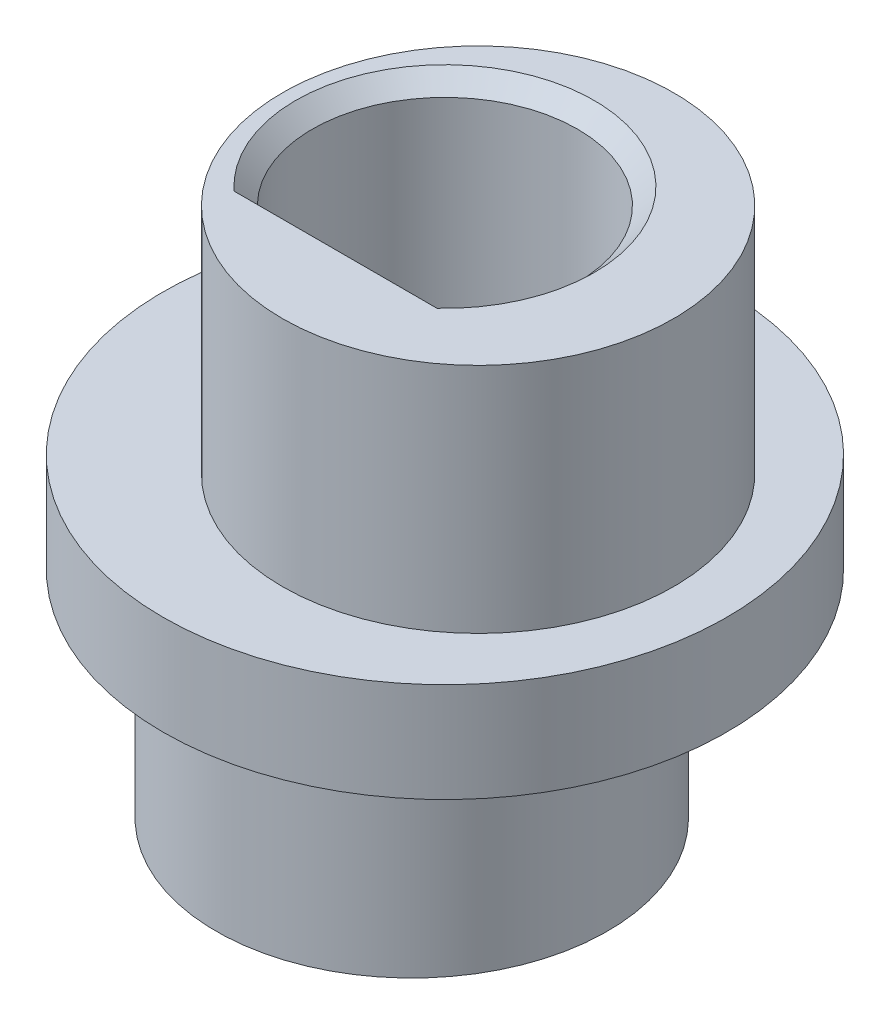
ISO-10303-21;
HEADER;
FILE_DESCRIPTION(('STEP AP214'),'2;1');
FILE_NAME('part.step','',(''),(''),'','','');
FILE_SCHEMA(('AUTOMOTIVE_DESIGN { 1 0 10303 214 1 1 1 1 }'));
ENDSEC;
DATA;
#1=APPLICATION_CONTEXT('core data for automotive mechanical design processes');
#2=APPLICATION_PROTOCOL_DEFINITION('international standard','automotive_design',2000,#1);
#3=PRODUCT_CONTEXT('',#1,'mechanical');
#4=PRODUCT('Part','Part','',(#3));
#5=PRODUCT_RELATED_PRODUCT_CATEGORY('part','',(#4));
#6=PRODUCT_DEFINITION_FORMATION('','',#4);
#7=PRODUCT_DEFINITION_CONTEXT('part definition',#1,'design');
#8=PRODUCT_DEFINITION('design','',#6,#7);
#9=PRODUCT_DEFINITION_SHAPE('','',#8);
#10=(LENGTH_UNIT() NAMED_UNIT(*) SI_UNIT(.MILLI.,.METRE.));
#11=(NAMED_UNIT(*) PLANE_ANGLE_UNIT() SI_UNIT($,.RADIAN.));
#12=(NAMED_UNIT(*) SI_UNIT($,.STERADIAN.) SOLID_ANGLE_UNIT());
#13=UNCERTAINTY_MEASURE_WITH_UNIT(LENGTH_MEASURE(1.E-05),#10,'distance_accuracy_value','');
#14=(GEOMETRIC_REPRESENTATION_CONTEXT(3) GLOBAL_UNCERTAINTY_ASSIGNED_CONTEXT((#13)) GLOBAL_UNIT_ASSIGNED_CONTEXT((#10,
#11,#12)) REPRESENTATION_CONTEXT('',''));
#15=CARTESIAN_POINT('',(0.,0.,0.));
#16=DIRECTION('',(0.,0.,1.));
#17=DIRECTION('',(1.,0.,0.));
#18=AXIS2_PLACEMENT_3D('',#15,#16,#17);
#19=CARTESIAN_POINT('',(0.,1.5,0.));
#20=DIRECTION('',(0.,-1.,0.));
#21=DIRECTION('',(0.,0.,-1.));
#22=AXIS2_PLACEMENT_3D('',#19,#20,#21);
#23=CYLINDRICAL_SURFACE('',#22,8.5);
#24=CARTESIAN_POINT('',(0.,1.5,0.));
#25=DIRECTION('',(0.,1.,0.));
#26=DIRECTION('',(0.,0.,1.));
#27=AXIS2_PLACEMENT_3D('',#24,#25,#26);
#28=CIRCLE('',#27,8.5);
#29=CARTESIAN_POINT('',(0.,1.5,8.5));
#30=VERTEX_POINT('',#29);
#31=EDGE_CURVE('E182',#30,#30,#28,.T.);
#32=ORIENTED_EDGE('',*,*,#31,.F.);
#33=EDGE_LOOP('',(#32));
#34=FACE_BOUND('',#33,.T.);
#35=CARTESIAN_POINT('',(0.,-1.5,0.));
#36=DIRECTION('',(0.,1.,0.));
#37=DIRECTION('',(0.,0.,1.));
#38=AXIS2_PLACEMENT_3D('',#35,#36,#37);
#39=CIRCLE('',#38,8.5);
#40=CARTESIAN_POINT('',(0.,-1.5,8.5));
#41=VERTEX_POINT('',#40);
#42=EDGE_CURVE('E178',#41,#41,#39,.T.);
#43=ORIENTED_EDGE('',*,*,#42,.T.);
#44=EDGE_LOOP('',(#43));
#45=FACE_BOUND('',#44,.T.);
#46=ADVANCED_FACE('F43',(#34,#45),#23,.T.);
#47=CARTESIAN_POINT('',(0.,1.5,0.));
#48=DIRECTION('',(0.,1.,0.));
#49=DIRECTION('',(0.,0.,1.));
#50=AXIS2_PLACEMENT_3D('',#47,#48,#49);
#51=PLANE('',#50);
#52=CARTESIAN_POINT('',(1.,1.5,0.));
#53=DIRECTION('',(0.,1.,0.));
#54=DIRECTION('',(0.,0.,1.));
#55=AXIS2_PLACEMENT_3D('',#52,#53,#54);
#56=CIRCLE('',#55,5.9);
#57=CARTESIAN_POINT('',(1.,1.5,5.9));
#58=VERTEX_POINT('',#57);
#59=EDGE_CURVE('E173',#58,#58,#56,.T.);
#60=ORIENTED_EDGE('',*,*,#59,.F.);
#61=EDGE_LOOP('',(#60));
#62=FACE_BOUND('',#61,.T.);
#63=ORIENTED_EDGE('',*,*,#31,.T.);
#64=EDGE_LOOP('',(#63));
#65=FACE_BOUND('',#64,.T.);
#66=ADVANCED_FACE('F188',(#62,#65),#51,.T.);
#67=CARTESIAN_POINT('',(0.,-1.5,0.));
#68=DIRECTION('',(0.,1.,0.));
#69=DIRECTION('',(0.,0.,1.));
#70=AXIS2_PLACEMENT_3D('',#67,#68,#69);
#71=PLANE('',#70);
#72=CARTESIAN_POINT('',(-1.,-1.5,0.));
#73=DIRECTION('',(0.,-1.,0.));
#74=DIRECTION('',(0.,0.,-1.));
#75=AXIS2_PLACEMENT_3D('',#72,#73,#74);
#76=CIRCLE('',#75,5.9);
#77=CARTESIAN_POINT('',(-1.,-1.5,-5.9));
#78=VERTEX_POINT('',#77);
#79=EDGE_CURVE('E106',#78,#78,#76,.T.);
#80=ORIENTED_EDGE('',*,*,#79,.F.);
#81=EDGE_LOOP('',(#80));
#82=FACE_BOUND('',#81,.T.);
#83=ORIENTED_EDGE('',*,*,#42,.F.);
#84=EDGE_LOOP('',(#83));
#85=FACE_BOUND('',#84,.T.);
#86=ADVANCED_FACE('F189',(#82,#85),#71,.F.);
#87=CARTESIAN_POINT('',(1.,8.5,0.));
#88=DIRECTION('',(0.,-1.,0.));
#89=DIRECTION('',(0.,0.,-1.));
#90=AXIS2_PLACEMENT_3D('',#87,#88,#89);
#91=CYLINDRICAL_SURFACE('',#90,5.9);
#92=CARTESIAN_POINT('',(1.,8.5,0.));
#93=DIRECTION('',(0.,1.,0.));
#94=DIRECTION('',(0.,0.,1.));
#95=AXIS2_PLACEMENT_3D('',#92,#93,#94);
#96=CIRCLE('',#95,5.9);
#97=CARTESIAN_POINT('',(1.,8.5,5.9));
#98=VERTEX_POINT('',#97);
#99=EDGE_CURVE('E166',#98,#98,#96,.T.);
#100=ORIENTED_EDGE('',*,*,#99,.F.);
#101=EDGE_LOOP('',(#100));
#102=FACE_BOUND('',#101,.T.);
#103=ORIENTED_EDGE('',*,*,#59,.T.);
#104=EDGE_LOOP('',(#103));
#105=FACE_BOUND('',#104,.T.);
#106=ADVANCED_FACE('F186',(#102,#105),#91,.T.);
#107=CARTESIAN_POINT('',(1.,8.5,0.));
#108=DIRECTION('',(0.,1.,0.));
#109=DIRECTION('',(0.,0.,1.));
#110=AXIS2_PLACEMENT_3D('',#107,#108,#109);
#111=PLANE('',#110);
#112=CARTESIAN_POINT('',(0.,8.5,0.));
#113=DIRECTION('',(0.,1.,0.));
#114=DIRECTION('',(0.,0.,1.));
#115=AXIS2_PLACEMENT_3D('',#112,#113,#114);
#116=CIRCLE('',#115,4.5);
#117=CARTESIAN_POINT('',(-3.05941170815665,8.5,3.2999999999991));
#118=VERTEX_POINT('',#117);
#119=CARTESIAN_POINT('',(3.05941170815665,8.5,3.2999999999991));
#120=VERTEX_POINT('',#119);
#121=EDGE_CURVE('E59',#118,#120,#116,.F.);
#122=ORIENTED_EDGE('',*,*,#121,.T.);
#123=DIRECTION('',(-1.,0.,0.));
#124=VECTOR('',#123,1.);
#125=CARTESIAN_POINT('',(-2.85657137141714,8.5,3.3));
#126=LINE('',#125,#124);
#127=EDGE_CURVE('E11',#120,#118,#126,.T.);
#128=ORIENTED_EDGE('',*,*,#127,.T.);
#129=EDGE_LOOP('',(#122,#128));
#130=FACE_BOUND('',#129,.T.);
#131=ORIENTED_EDGE('',*,*,#99,.T.);
#132=EDGE_LOOP('',(#131));
#133=FACE_BOUND('',#132,.T.);
#134=ADVANCED_FACE('F197',(#130,#133),#111,.T.);
#135=CARTESIAN_POINT('',(-1.,-8.5,0.));
#136=DIRECTION('',(0.,1.,0.));
#137=DIRECTION('',(0.,0.,1.));
#138=AXIS2_PLACEMENT_3D('',#135,#136,#137);
#139=CYLINDRICAL_SURFACE('',#138,5.9);
#140=CARTESIAN_POINT('',(-1.,-8.5,0.));
#141=DIRECTION('',(0.,-1.,0.));
#142=DIRECTION('',(0.,0.,-1.));
#143=AXIS2_PLACEMENT_3D('',#140,#141,#142);
#144=CIRCLE('',#143,5.9);
#145=CARTESIAN_POINT('',(-1.,-8.5,-5.9));
#146=VERTEX_POINT('',#145);
#147=EDGE_CURVE('E167',#146,#146,#144,.T.);
#148=ORIENTED_EDGE('',*,*,#147,.F.);
#149=EDGE_LOOP('',(#148));
#150=FACE_BOUND('',#149,.T.);
#151=ORIENTED_EDGE('',*,*,#79,.T.);
#152=EDGE_LOOP('',(#151));
#153=FACE_BOUND('',#152,.T.);
#154=ADVANCED_FACE('F233',(#150,#153),#139,.T.);
#155=CARTESIAN_POINT('',(-1.,-8.5,0.));
#156=DIRECTION('',(0.,-1.,0.));
#157=DIRECTION('',(0.,0.,-1.));
#158=AXIS2_PLACEMENT_3D('',#155,#156,#157);
#159=PLANE('',#158);
#160=CARTESIAN_POINT('',(0.,-8.5,0.));
#161=DIRECTION('',(0.,-1.,0.));
#162=DIRECTION('',(0.,0.,-1.));
#163=AXIS2_PLACEMENT_3D('',#160,#161,#162);
#164=CIRCLE('',#163,4.50000000000001);
#165=CARTESIAN_POINT('',(3.05941170815665,-8.5,3.2999999999991));
#166=VERTEX_POINT('',#165);
#167=CARTESIAN_POINT('',(-3.05941170815665,-8.5,3.2999999999991));
#168=VERTEX_POINT('',#167);
#169=EDGE_CURVE('E103',#166,#168,#164,.F.);
#170=ORIENTED_EDGE('',*,*,#169,.T.);
#171=DIRECTION('',(1.,0.,0.));
#172=VECTOR('',#171,1.);
#173=CARTESIAN_POINT('',(2.85657137141714,-8.5,3.30000000000001));
#174=LINE('',#173,#172);
#175=EDGE_CURVE('E92',#168,#166,#174,.T.);
#176=ORIENTED_EDGE('',*,*,#175,.T.);
#177=EDGE_LOOP('',(#170,#176));
#178=FACE_BOUND('',#177,.T.);
#179=ORIENTED_EDGE('',*,*,#147,.T.);
#180=EDGE_LOOP('',(#179));
#181=FACE_BOUND('',#180,.T.);
#182=ADVANCED_FACE('F107',(#178,#181),#159,.T.);
#183=CARTESIAN_POINT('',(0.,-8.5,0.));
#184=DIRECTION('',(0.,1.,0.));
#185=DIRECTION('',(0.,0.,1.));
#186=AXIS2_PLACEMENT_3D('',#183,#184,#185);
#187=CYLINDRICAL_SURFACE('',#186,4.);
#188=DIRECTION('',(0.,1.,0.));
#189=VECTOR('',#188,1.);
#190=CARTESIAN_POINT('',(-2.85657137141714,-8.5,2.8));
#191=LINE('',#190,#189);
#192=CARTESIAN_POINT('',(-2.85657137141714,-7.99999999999999,2.8));
#193=VERTEX_POINT('',#192);
#194=CARTESIAN_POINT('',(-2.85657137141714,8.,2.8));
#195=VERTEX_POINT('',#194);
#196=EDGE_CURVE('E163',#193,#195,#191,.T.);
#197=ORIENTED_EDGE('',*,*,#196,.F.);
#198=CARTESIAN_POINT('',(0.,-7.99999999999999,0.));
#199=DIRECTION('',(0.,-1.,0.));
#200=DIRECTION('',(0.,0.,-1.));
#201=AXIS2_PLACEMENT_3D('',#198,#199,#200);
#202=CIRCLE('',#201,4.);
#203=CARTESIAN_POINT('',(2.85657137141714,-7.99999999999999,2.8));
#204=VERTEX_POINT('',#203);
#205=EDGE_CURVE('E116',#193,#204,#202,.T.);
#206=ORIENTED_EDGE('',*,*,#205,.T.);
#207=DIRECTION('',(0.,1.,0.));
#208=VECTOR('',#207,1.);
#209=CARTESIAN_POINT('',(2.85657137141714,-8.5,2.8));
#210=LINE('',#209,#208);
#211=CARTESIAN_POINT('',(2.85657137141714,8.,2.8));
#212=VERTEX_POINT('',#211);
#213=EDGE_CURVE('E162',#204,#212,#210,.T.);
#214=ORIENTED_EDGE('',*,*,#213,.T.);
#215=CARTESIAN_POINT('',(0.,8.,0.));
#216=DIRECTION('',(0.,1.,0.));
#217=DIRECTION('',(0.,0.,1.));
#218=AXIS2_PLACEMENT_3D('',#215,#216,#217);
#219=CIRCLE('',#218,4.);
#220=EDGE_CURVE('E119',#212,#195,#219,.T.);
#221=ORIENTED_EDGE('',*,*,#220,.T.);
#222=EDGE_LOOP('',(#197,#206,#214,#221));
#223=FACE_BOUND('',#222,.T.);
#224=ADVANCED_FACE('F164',(#223),#187,.F.);
#225=CARTESIAN_POINT('',(-2.85657137141714,-8.5,2.8));
#226=DIRECTION('',(0.,0.,1.));
#227=DIRECTION('',(1.,0.,0.));
#228=AXIS2_PLACEMENT_3D('',#225,#226,#227);
#229=PLANE('',#228);
#230=ORIENTED_EDGE('',*,*,#213,.F.);
#231=DIRECTION('',(-1.,0.,0.));
#232=VECTOR('',#231,1.);
#233=CARTESIAN_POINT('',(-2.85657137141714,-7.99999999999999,2.8));
#234=LINE('',#233,#232);
#235=EDGE_CURVE('E100',#204,#193,#234,.T.);
#236=ORIENTED_EDGE('',*,*,#235,.T.);
#237=ORIENTED_EDGE('',*,*,#196,.T.);
#238=DIRECTION('',(1.,0.,0.));
#239=VECTOR('',#238,1.);
#240=CARTESIAN_POINT('',(2.85657137141714,8.,2.8));
#241=LINE('',#240,#239);
#242=EDGE_CURVE('E109',#195,#212,#241,.T.);
#243=ORIENTED_EDGE('',*,*,#242,.T.);
#244=EDGE_LOOP('',(#230,#236,#237,#243));
#245=FACE_BOUND('',#244,.T.);
#246=ADVANCED_FACE('F139',(#245),#229,.F.);
#247=CARTESIAN_POINT('',(0.,-8.5,0.));
#248=DIRECTION('',(0.,-1.,0.));
#249=DIRECTION('',(0.,0.,-1.));
#250=AXIS2_PLACEMENT_3D('',#247,#248,#249);
#251=CONICAL_SURFACE('',#250,4.50000000000001,0.785398163397448);
#252=CARTESIAN_POINT('',(3.05941170815749,-8.5,3.30000000000001));
#253=CARTESIAN_POINT('',(3.02667575156098,-8.4164495816364,3.21644958163641));
#254=CARTESIAN_POINT('',(2.99340443304797,-8.33300775626197,3.13300775626198));
#255=CARTESIAN_POINT('',(2.92579099006949,-8.16634108906759,2.9663410890676));
#256=CARTESIAN_POINT('',(2.89144886300313,-8.08311624777521,2.88311624777522));
#257=CARTESIAN_POINT('',(2.85657137141939,-7.99999999999955,2.79999999999956));
#258=B_SPLINE_CURVE_WITH_KNOTS('',3,(#252,#253,#254,#255,#256,#257),.UNSPECIFIED.,.F.,.F.,(4,2,
4),(0.,0.367815869305649,0.73563263206875),.UNSPECIFIED.);
#259=EDGE_CURVE('E93',#204,#166,#258,.F.);
#260=ORIENTED_EDGE('',*,*,#259,.F.);
#261=ORIENTED_EDGE('',*,*,#205,.F.);
#262=CARTESIAN_POINT('',(-2.85657137141714,-7.99999999999999,2.8));
#263=CARTESIAN_POINT('',(-2.89144886300229,-8.08311624777537,2.88311624777538));
#264=CARTESIAN_POINT('',(-2.92579099006939,-8.1663410890676,2.96634108906761));
#265=CARTESIAN_POINT('',(-2.99340443304806,-8.33300775626195,3.13300775626196));
#266=CARTESIAN_POINT('',(-3.02667575156052,-8.41644958163651,3.21644958163651));
#267=CARTESIAN_POINT('',(-3.05941170815581,-8.50000000000035,3.30000000000036));
#268=B_SPLINE_CURVE_WITH_KNOTS('',3,(#262,#263,#264,#265,#266,#267),.UNSPECIFIED.,.F.,.F.,(4,2,
4),(0.,0.367816762763132,0.735632632068806),.UNSPECIFIED.);
#269=EDGE_CURVE('E99',#168,#193,#268,.F.);
#270=ORIENTED_EDGE('',*,*,#269,.F.);
#271=ORIENTED_EDGE('',*,*,#169,.F.);
#272=EDGE_LOOP('',(#260,#261,#270,#271));
#273=FACE_BOUND('',#272,.T.);
#274=ADVANCED_FACE('F102',(#273),#251,.F.);
#275=CARTESIAN_POINT('',(-1.,-8.5,3.30000000000001));
#276=DIRECTION('',(0.,-0.707106781186547,-0.707106781186547));
#277=DIRECTION('',(-1.,0.,0.));
#278=AXIS2_PLACEMENT_3D('',#275,#276,#277);
#279=PLANE('',#278);
#280=ORIENTED_EDGE('',*,*,#269,.T.);
#281=ORIENTED_EDGE('',*,*,#235,.F.);
#282=ORIENTED_EDGE('',*,*,#259,.T.);
#283=ORIENTED_EDGE('',*,*,#175,.F.);
#284=EDGE_LOOP('',(#280,#281,#282,#283));
#285=FACE_BOUND('',#284,.T.);
#286=ADVANCED_FACE('F91',(#285),#279,.T.);
#287=CARTESIAN_POINT('',(0.,8.,0.));
#288=DIRECTION('',(0.,1.,0.));
#289=DIRECTION('',(0.,0.,1.));
#290=AXIS2_PLACEMENT_3D('',#287,#288,#289);
#291=CONICAL_SURFACE('',#290,4.,0.785398163397448);
#292=CARTESIAN_POINT('',(2.85657137141714,8.,2.8));
#293=CARTESIAN_POINT('',(2.89144886300229,8.08311624777537,2.88311624777537));
#294=CARTESIAN_POINT('',(2.92579099006939,8.1663410890676,2.96634108906761));
#295=CARTESIAN_POINT('',(2.99340443304806,8.33300775626195,3.13300775626196));
#296=CARTESIAN_POINT('',(3.02667575156052,8.41644958163651,3.21644958163651));
#297=CARTESIAN_POINT('',(3.05941170815581,8.50000000000035,3.30000000000036));
#298=B_SPLINE_CURVE_WITH_KNOTS('',3,(#292,#293,#294,#295,#296,#297),.UNSPECIFIED.,.F.,.F.,(4,2,
4),(0.,0.367816762763128,0.735632632068801),.UNSPECIFIED.);
#299=EDGE_CURVE('E149',#120,#212,#298,.F.);
#300=ORIENTED_EDGE('',*,*,#299,.F.);
#301=ORIENTED_EDGE('',*,*,#121,.F.);
#302=CARTESIAN_POINT('',(-3.05941170815749,8.5,3.3));
#303=CARTESIAN_POINT('',(-3.02667575156098,8.4164495816364,3.21644958163641));
#304=CARTESIAN_POINT('',(-2.99340443304797,8.33300775626197,3.13300775626197));
#305=CARTESIAN_POINT('',(-2.92579099006949,8.16634108906759,2.96634108906759));
#306=CARTESIAN_POINT('',(-2.89144886300313,8.08311624777521,2.88311624777521));
#307=CARTESIAN_POINT('',(-2.85657137141938,7.99999999999956,2.79999999999956));
#308=B_SPLINE_CURVE_WITH_KNOTS('',3,(#302,#303,#304,#305,#306,#307),.UNSPECIFIED.,.F.,.F.,(4,2,
4),(0.,0.367815869305647,0.735632632068745),.UNSPECIFIED.);
#309=EDGE_CURVE('E47',#195,#118,#308,.F.);
#310=ORIENTED_EDGE('',*,*,#309,.F.);
#311=ORIENTED_EDGE('',*,*,#220,.F.);
#312=EDGE_LOOP('',(#300,#301,#310,#311));
#313=FACE_BOUND('',#312,.T.);
#314=ADVANCED_FACE('F46',(#313),#291,.F.);
#315=CARTESIAN_POINT('',(-2.85657137141714,8.,2.8));
#316=DIRECTION('',(0.,0.707106781186547,-0.707106781186547));
#317=DIRECTION('',(-1.,0.,0.));
#318=AXIS2_PLACEMENT_3D('',#315,#316,#317);
#319=PLANE('',#318);
#320=ORIENTED_EDGE('',*,*,#309,.T.);
#321=ORIENTED_EDGE('',*,*,#127,.F.);
#322=ORIENTED_EDGE('',*,*,#299,.T.);
#323=ORIENTED_EDGE('',*,*,#242,.F.);
#324=EDGE_LOOP('',(#320,#321,#322,#323));
#325=FACE_BOUND('',#324,.T.);
#326=ADVANCED_FACE('F142',(#325),#319,.T.);
#327=CLOSED_SHELL('',(#46,#66,#86,#106,#134,#154,#182,#224,#246,#274,#286,#314,#326));
#328=MANIFOLD_SOLID_BREP('B2',#327);
#329=ADVANCED_BREP_SHAPE_REPRESENTATION('',(#18,#328),#14);
#330=SHAPE_DEFINITION_REPRESENTATION(#9,#329);
ENDSEC;
END-ISO-10303-21;
